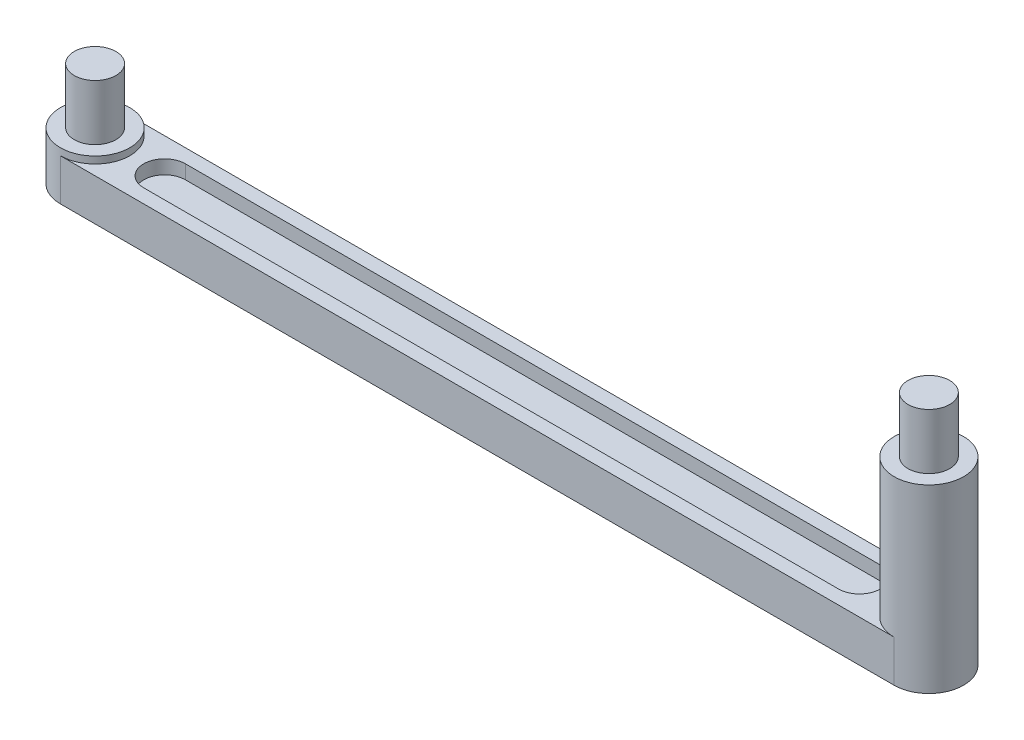
ISO-10303-21;
HEADER;
FILE_DESCRIPTION(('STEP AP214'),'2;1');
FILE_NAME('part.step','',(''),(''),'','','');
FILE_SCHEMA(('AUTOMOTIVE_DESIGN { 1 0 10303 214 1 1 1 1 }'));
ENDSEC;
DATA;
#1=APPLICATION_CONTEXT('core data for automotive mechanical design processes');
#2=APPLICATION_PROTOCOL_DEFINITION('international standard','automotive_design',2000,#1);
#3=PRODUCT_CONTEXT('',#1,'mechanical');
#4=PRODUCT('Part','Part','',(#3));
#5=PRODUCT_RELATED_PRODUCT_CATEGORY('part','',(#4));
#6=PRODUCT_DEFINITION_FORMATION('','',#4);
#7=PRODUCT_DEFINITION_CONTEXT('part definition',#1,'design');
#8=PRODUCT_DEFINITION('design','',#6,#7);
#9=PRODUCT_DEFINITION_SHAPE('','',#8);
#10=(LENGTH_UNIT() NAMED_UNIT(*) SI_UNIT(.MILLI.,.METRE.));
#11=(NAMED_UNIT(*) PLANE_ANGLE_UNIT() SI_UNIT($,.RADIAN.));
#12=(NAMED_UNIT(*) SI_UNIT($,.STERADIAN.) SOLID_ANGLE_UNIT());
#13=UNCERTAINTY_MEASURE_WITH_UNIT(LENGTH_MEASURE(1.E-05),#10,'distance_accuracy_value','');
#14=(GEOMETRIC_REPRESENTATION_CONTEXT(3) GLOBAL_UNCERTAINTY_ASSIGNED_CONTEXT((#13)) GLOBAL_UNIT_ASSIGNED_CONTEXT((#10,
#11,#12)) REPRESENTATION_CONTEXT('',''));
#15=CARTESIAN_POINT('',(0.,0.,0.));
#16=DIRECTION('',(0.,0.,1.));
#17=DIRECTION('',(1.,0.,0.));
#18=AXIS2_PLACEMENT_3D('',#15,#16,#17);
#19=CARTESIAN_POINT('',(30.,3.,0.));
#20=DIRECTION('',(0.,1.,0.));
#21=DIRECTION('',(0.,0.,1.));
#22=AXIS2_PLACEMENT_3D('',#19,#20,#21);
#23=PLANE('',#22);
#24=CARTESIAN_POINT('',(25.,3.,0.));
#25=DIRECTION('',(0.,1.,0.));
#26=DIRECTION('',(0.,0.,1.));
#27=AXIS2_PLACEMENT_3D('',#24,#25,#26);
#28=CIRCLE('',#27,1.50000000000001);
#29=CARTESIAN_POINT('',(25.,3.,1.50000000000001));
#30=VERTEX_POINT('',#29);
#31=CARTESIAN_POINT('',(25.,3.,-1.50000000000001));
#32=VERTEX_POINT('',#31);
#33=EDGE_CURVE('E57',#30,#32,#28,.T.);
#34=ORIENTED_EDGE('',*,*,#33,.F.);
#35=DIRECTION('',(1.,0.,0.));
#36=VECTOR('',#35,1.);
#37=CARTESIAN_POINT('',(25.,3.,1.50000000000001));
#38=LINE('',#37,#36);
#39=CARTESIAN_POINT('',(-25.,3.,1.50000000000001));
#40=VERTEX_POINT('',#39);
#41=EDGE_CURVE('E189',#40,#30,#38,.T.);
#42=ORIENTED_EDGE('',*,*,#41,.F.);
#43=CARTESIAN_POINT('',(-25.,3.,0.));
#44=DIRECTION('',(0.,1.,0.));
#45=DIRECTION('',(0.,0.,1.));
#46=AXIS2_PLACEMENT_3D('',#43,#44,#45);
#47=CIRCLE('',#46,1.50000000000001);
#48=CARTESIAN_POINT('',(-25.,3.,-1.50000000000001));
#49=VERTEX_POINT('',#48);
#50=EDGE_CURVE('E174',#49,#40,#47,.T.);
#51=ORIENTED_EDGE('',*,*,#50,.F.);
#52=DIRECTION('',(-1.,0.,0.));
#53=VECTOR('',#52,1.);
#54=CARTESIAN_POINT('',(25.,3.,-1.50000000000001));
#55=LINE('',#54,#53);
#56=EDGE_CURVE('E184',#32,#49,#55,.T.);
#57=ORIENTED_EDGE('',*,*,#56,.F.);
#58=EDGE_LOOP('',(#34,#42,#51,#57));
#59=FACE_BOUND('',#58,.T.);
#60=DIRECTION('',(1.,0.,0.));
#61=VECTOR('',#60,1.);
#62=CARTESIAN_POINT('',(30.,3.,2.49999999999999));
#63=LINE('',#62,#61);
#64=CARTESIAN_POINT('',(-30.,3.,2.50000000000001));
#65=VERTEX_POINT('',#64);
#66=CARTESIAN_POINT('',(30.,3.,2.49999999999999));
#67=VERTEX_POINT('',#66);
#68=EDGE_CURVE('E65',#65,#67,#63,.T.);
#69=ORIENTED_EDGE('',*,*,#68,.T.);
#70=CARTESIAN_POINT('',(30.,3.,0.));
#71=DIRECTION('',(0.,1.,0.));
#72=DIRECTION('',(0.,0.,1.));
#73=AXIS2_PLACEMENT_3D('',#70,#71,#72);
#74=CIRCLE('',#73,2.5);
#75=CARTESIAN_POINT('',(30.,3.,-2.50000000000001));
#76=VERTEX_POINT('',#75);
#77=EDGE_CURVE('E12',#67,#76,#74,.F.);
#78=ORIENTED_EDGE('',*,*,#77,.T.);
#79=DIRECTION('',(-1.,0.,0.));
#80=VECTOR('',#79,1.);
#81=CARTESIAN_POINT('',(30.,3.,-2.50000000000001));
#82=LINE('',#81,#80);
#83=CARTESIAN_POINT('',(-30.,3.,-2.5));
#84=VERTEX_POINT('',#83);
#85=EDGE_CURVE('E95',#76,#84,#82,.T.);
#86=ORIENTED_EDGE('',*,*,#85,.T.);
#87=CARTESIAN_POINT('',(-30.,3.,0.));
#88=DIRECTION('',(0.,1.,0.));
#89=DIRECTION('',(0.,0.,1.));
#90=AXIS2_PLACEMENT_3D('',#87,#88,#89);
#91=CIRCLE('',#90,2.5);
#92=EDGE_CURVE('E111',#65,#84,#91,.T.);
#93=ORIENTED_EDGE('',*,*,#92,.F.);
#94=EDGE_LOOP('',(#69,#78,#86,#93));
#95=FACE_BOUND('',#94,.T.);
#96=ADVANCED_FACE('F41',(#59,#95),#23,.T.);
#97=CARTESIAN_POINT('',(30.,3.,0.));
#98=DIRECTION('',(0.,-1.,0.));
#99=DIRECTION('',(0.,0.,-1.));
#100=AXIS2_PLACEMENT_3D('',#97,#98,#99);
#101=CYLINDRICAL_SURFACE('',#100,2.5);
#102=CARTESIAN_POINT('',(30.,0.,0.));
#103=DIRECTION('',(0.,1.,0.));
#104=DIRECTION('',(0.,0.,1.));
#105=AXIS2_PLACEMENT_3D('',#102,#103,#104);
#106=CIRCLE('',#105,2.5);
#107=CARTESIAN_POINT('',(30.,0.,2.49999999999999));
#108=VERTEX_POINT('',#107);
#109=CARTESIAN_POINT('',(30.,0.,-2.50000000000001));
#110=VERTEX_POINT('',#109);
#111=EDGE_CURVE('E102',#108,#110,#106,.T.);
#112=ORIENTED_EDGE('',*,*,#111,.T.);
#113=DIRECTION('',(0.,-1.,0.));
#114=VECTOR('',#113,1.);
#115=CARTESIAN_POINT('',(30.,3.,-2.50000000000001));
#116=LINE('',#115,#114);
#117=EDGE_CURVE('E50',#76,#110,#116,.T.);
#118=ORIENTED_EDGE('',*,*,#117,.F.);
#119=ORIENTED_EDGE('',*,*,#77,.F.);
#120=DIRECTION('',(0.,-1.,0.));
#121=VECTOR('',#120,1.);
#122=CARTESIAN_POINT('',(30.,3.,2.49999999999999));
#123=LINE('',#122,#121);
#124=EDGE_CURVE('E88',#67,#108,#123,.T.);
#125=ORIENTED_EDGE('',*,*,#124,.T.);
#126=EDGE_LOOP('',(#112,#118,#119,#125));
#127=FACE_BOUND('',#126,.T.);
#128=CARTESIAN_POINT('',(30.,13.,0.));
#129=DIRECTION('',(0.,1.,0.));
#130=DIRECTION('',(0.,0.,1.));
#131=AXIS2_PLACEMENT_3D('',#128,#129,#130);
#132=CIRCLE('',#131,2.5);
#133=CARTESIAN_POINT('',(30.,13.,2.49999999999999));
#134=VERTEX_POINT('',#133);
#135=EDGE_CURVE('E130',#134,#134,#132,.T.);
#136=ORIENTED_EDGE('',*,*,#135,.F.);
#137=EDGE_LOOP('',(#136));
#138=FACE_BOUND('',#137,.T.);
#139=ADVANCED_FACE('F43',(#127,#138),#101,.T.);
#140=CARTESIAN_POINT('',(30.,3.,-2.50000000000001));
#141=DIRECTION('',(0.,0.,1.));
#142=DIRECTION('',(1.,0.,0.));
#143=AXIS2_PLACEMENT_3D('',#140,#141,#142);
#144=PLANE('',#143);
#145=DIRECTION('',(-1.,0.,0.));
#146=VECTOR('',#145,1.);
#147=CARTESIAN_POINT('',(30.,0.,-2.50000000000001));
#148=LINE('',#147,#146);
#149=CARTESIAN_POINT('',(-30.,0.,-2.5));
#150=VERTEX_POINT('',#149);
#151=EDGE_CURVE('E105',#110,#150,#148,.T.);
#152=ORIENTED_EDGE('',*,*,#151,.T.);
#153=DIRECTION('',(0.,-1.,0.));
#154=VECTOR('',#153,1.);
#155=CARTESIAN_POINT('',(-30.,3.,-2.5));
#156=LINE('',#155,#154);
#157=EDGE_CURVE('E118',#84,#150,#156,.T.);
#158=ORIENTED_EDGE('',*,*,#157,.F.);
#159=ORIENTED_EDGE('',*,*,#85,.F.);
#160=ORIENTED_EDGE('',*,*,#117,.T.);
#161=EDGE_LOOP('',(#152,#158,#159,#160));
#162=FACE_BOUND('',#161,.T.);
#163=ADVANCED_FACE('F141',(#162),#144,.F.);
#164=CARTESIAN_POINT('',(-30.,3.,0.));
#165=DIRECTION('',(0.,-1.,0.));
#166=DIRECTION('',(0.,0.,-1.));
#167=AXIS2_PLACEMENT_3D('',#164,#165,#166);
#168=CYLINDRICAL_SURFACE('',#167,2.5);
#169=CARTESIAN_POINT('',(-30.,0.,0.));
#170=DIRECTION('',(0.,1.,0.));
#171=DIRECTION('',(0.,0.,1.));
#172=AXIS2_PLACEMENT_3D('',#169,#170,#171);
#173=CIRCLE('',#172,2.5);
#174=CARTESIAN_POINT('',(-30.,0.,2.50000000000001));
#175=VERTEX_POINT('',#174);
#176=EDGE_CURVE('E96',#150,#175,#173,.T.);
#177=ORIENTED_EDGE('',*,*,#176,.T.);
#178=DIRECTION('',(0.,-1.,0.));
#179=VECTOR('',#178,1.);
#180=CARTESIAN_POINT('',(-30.,3.,2.50000000000001));
#181=LINE('',#180,#179);
#182=EDGE_CURVE('E91',#65,#175,#181,.T.);
#183=ORIENTED_EDGE('',*,*,#182,.F.);
#184=ORIENTED_EDGE('',*,*,#92,.T.);
#185=ORIENTED_EDGE('',*,*,#157,.T.);
#186=EDGE_LOOP('',(#177,#183,#184,#185));
#187=FACE_BOUND('',#186,.T.);
#188=CARTESIAN_POINT('',(-30.,3.5,0.));
#189=DIRECTION('',(0.,1.,0.));
#190=DIRECTION('',(0.,0.,1.));
#191=AXIS2_PLACEMENT_3D('',#188,#189,#190);
#192=CIRCLE('',#191,2.5);
#193=CARTESIAN_POINT('',(-30.,3.5,2.50000000000001));
#194=VERTEX_POINT('',#193);
#195=EDGE_CURVE('E107',#194,#194,#192,.T.);
#196=ORIENTED_EDGE('',*,*,#195,.F.);
#197=EDGE_LOOP('',(#196));
#198=FACE_BOUND('',#197,.T.);
#199=ADVANCED_FACE('F143',(#187,#198),#168,.T.);
#200=CARTESIAN_POINT('',(30.,3.,2.49999999999999));
#201=DIRECTION('',(0.,0.,-1.));
#202=DIRECTION('',(-1.,0.,0.));
#203=AXIS2_PLACEMENT_3D('',#200,#201,#202);
#204=PLANE('',#203);
#205=DIRECTION('',(1.,0.,0.));
#206=VECTOR('',#205,1.);
#207=CARTESIAN_POINT('',(30.,0.,2.49999999999999));
#208=LINE('',#207,#206);
#209=EDGE_CURVE('E85',#175,#108,#208,.T.);
#210=ORIENTED_EDGE('',*,*,#209,.T.);
#211=ORIENTED_EDGE('',*,*,#124,.F.);
#212=ORIENTED_EDGE('',*,*,#68,.F.);
#213=ORIENTED_EDGE('',*,*,#182,.T.);
#214=EDGE_LOOP('',(#210,#211,#212,#213));
#215=FACE_BOUND('',#214,.T.);
#216=ADVANCED_FACE('F87',(#215),#204,.F.);
#217=CARTESIAN_POINT('',(30.,0.,0.));
#218=DIRECTION('',(0.,1.,0.));
#219=DIRECTION('',(0.,0.,1.));
#220=AXIS2_PLACEMENT_3D('',#217,#218,#219);
#221=PLANE('',#220);
#222=ORIENTED_EDGE('',*,*,#111,.F.);
#223=ORIENTED_EDGE('',*,*,#209,.F.);
#224=ORIENTED_EDGE('',*,*,#176,.F.);
#225=ORIENTED_EDGE('',*,*,#151,.F.);
#226=EDGE_LOOP('',(#222,#223,#224,#225));
#227=FACE_BOUND('',#226,.T.);
#228=ADVANCED_FACE('F104',(#227),#221,.F.);
#229=CARTESIAN_POINT('',(0.,3.5,0.));
#230=DIRECTION('',(0.,1.,0.));
#231=DIRECTION('',(0.,0.,1.));
#232=AXIS2_PLACEMENT_3D('',#229,#230,#231);
#233=PLANE('',#232);
#234=CARTESIAN_POINT('',(-30.,3.5,0.));
#235=DIRECTION('',(0.,1.,0.));
#236=DIRECTION('',(0.,0.,1.));
#237=AXIS2_PLACEMENT_3D('',#234,#235,#236);
#238=CIRCLE('',#237,1.5);
#239=CARTESIAN_POINT('',(-30.,3.5,1.50000000000001));
#240=VERTEX_POINT('',#239);
#241=EDGE_CURVE('E122',#240,#240,#238,.F.);
#242=ORIENTED_EDGE('',*,*,#241,.T.);
#243=EDGE_LOOP('',(#242));
#244=FACE_BOUND('',#243,.T.);
#245=ORIENTED_EDGE('',*,*,#195,.T.);
#246=EDGE_LOOP('',(#245));
#247=FACE_BOUND('',#246,.T.);
#248=ADVANCED_FACE('F231',(#244,#247),#233,.T.);
#249=CARTESIAN_POINT('',(-30.,15.7426406871193,0.));
#250=DIRECTION('',(0.,-1.,0.));
#251=DIRECTION('',(0.,0.,-1.));
#252=AXIS2_PLACEMENT_3D('',#249,#250,#251);
#253=CYLINDRICAL_SURFACE('',#252,1.5);
#254=ORIENTED_EDGE('',*,*,#241,.F.);
#255=EDGE_LOOP('',(#254));
#256=FACE_BOUND('',#255,.T.);
#257=CARTESIAN_POINT('',(-30.,7.5,0.));
#258=DIRECTION('',(0.,1.,0.));
#259=DIRECTION('',(0.,0.,1.));
#260=AXIS2_PLACEMENT_3D('',#257,#258,#259);
#261=CIRCLE('',#260,1.5);
#262=CARTESIAN_POINT('',(-30.,7.5,1.50000000000001));
#263=VERTEX_POINT('',#262);
#264=EDGE_CURVE('E124',#263,#263,#261,.T.);
#265=ORIENTED_EDGE('',*,*,#264,.F.);
#266=EDGE_LOOP('',(#265));
#267=FACE_BOUND('',#266,.T.);
#268=ADVANCED_FACE('F263',(#256,#267),#253,.T.);
#269=CARTESIAN_POINT('',(0.,7.5,0.));
#270=DIRECTION('',(0.,1.,0.));
#271=DIRECTION('',(0.,0.,1.));
#272=AXIS2_PLACEMENT_3D('',#269,#270,#271);
#273=PLANE('',#272);
#274=ORIENTED_EDGE('',*,*,#264,.T.);
#275=EDGE_LOOP('',(#274));
#276=FACE_BOUND('',#275,.T.);
#277=ADVANCED_FACE('F221',(#276),#273,.T.);
#278=CARTESIAN_POINT('',(0.,13.,0.));
#279=DIRECTION('',(0.,1.,0.));
#280=DIRECTION('',(0.,0.,1.));
#281=AXIS2_PLACEMENT_3D('',#278,#279,#280);
#282=PLANE('',#281);
#283=CARTESIAN_POINT('',(30.,13.,0.));
#284=DIRECTION('',(0.,1.,0.));
#285=DIRECTION('',(0.,0.,1.));
#286=AXIS2_PLACEMENT_3D('',#283,#284,#285);
#287=CIRCLE('',#286,1.5);
#288=CARTESIAN_POINT('',(30.,13.,1.49999999999999));
#289=VERTEX_POINT('',#288);
#290=EDGE_CURVE('E45',#289,#289,#287,.F.);
#291=ORIENTED_EDGE('',*,*,#290,.T.);
#292=EDGE_LOOP('',(#291));
#293=FACE_BOUND('',#292,.T.);
#294=ORIENTED_EDGE('',*,*,#135,.T.);
#295=EDGE_LOOP('',(#294));
#296=FACE_BOUND('',#295,.T.);
#297=ADVANCED_FACE('F207',(#293,#296),#282,.T.);
#298=CARTESIAN_POINT('',(30.,25.2426406871193,0.));
#299=DIRECTION('',(0.,-1.,0.));
#300=DIRECTION('',(0.,0.,-1.));
#301=AXIS2_PLACEMENT_3D('',#298,#299,#300);
#302=CYLINDRICAL_SURFACE('',#301,1.5);
#303=ORIENTED_EDGE('',*,*,#290,.F.);
#304=EDGE_LOOP('',(#303));
#305=FACE_BOUND('',#304,.T.);
#306=CARTESIAN_POINT('',(30.,17.,0.));
#307=DIRECTION('',(0.,1.,0.));
#308=DIRECTION('',(0.,0.,1.));
#309=AXIS2_PLACEMENT_3D('',#306,#307,#308);
#310=CIRCLE('',#309,1.5);
#311=CARTESIAN_POINT('',(30.,17.,1.49999999999999));
#312=VERTEX_POINT('',#311);
#313=EDGE_CURVE('E199',#312,#312,#310,.T.);
#314=ORIENTED_EDGE('',*,*,#313,.F.);
#315=EDGE_LOOP('',(#314));
#316=FACE_BOUND('',#315,.T.);
#317=ADVANCED_FACE('F210',(#305,#316),#302,.T.);
#318=CARTESIAN_POINT('',(0.,17.,0.));
#319=DIRECTION('',(0.,1.,0.));
#320=DIRECTION('',(0.,0.,1.));
#321=AXIS2_PLACEMENT_3D('',#318,#319,#320);
#322=PLANE('',#321);
#323=ORIENTED_EDGE('',*,*,#313,.T.);
#324=EDGE_LOOP('',(#323));
#325=FACE_BOUND('',#324,.T.);
#326=ADVANCED_FACE('F213',(#325),#322,.T.);
#327=CARTESIAN_POINT('',(25.,-53.084837759948,0.));
#328=DIRECTION('',(0.,1.,0.));
#329=DIRECTION('',(0.,0.,1.));
#330=AXIS2_PLACEMENT_3D('',#327,#328,#329);
#331=CYLINDRICAL_SURFACE('',#330,1.50000000000001);
#332=CARTESIAN_POINT('',(25.,2.,0.));
#333=DIRECTION('',(0.,1.,0.));
#334=DIRECTION('',(0.,0.,1.));
#335=AXIS2_PLACEMENT_3D('',#332,#333,#334);
#336=CIRCLE('',#335,1.50000000000001);
#337=CARTESIAN_POINT('',(25.,2.,-1.50000000000001));
#338=VERTEX_POINT('',#337);
#339=CARTESIAN_POINT('',(25.,2.,1.50000000000001));
#340=VERTEX_POINT('',#339);
#341=EDGE_CURVE('E200',#338,#340,#336,.F.);
#342=ORIENTED_EDGE('',*,*,#341,.T.);
#343=DIRECTION('',(0.,1.,0.));
#344=VECTOR('',#343,1.);
#345=CARTESIAN_POINT('',(25.,-53.084837759948,1.50000000000001));
#346=LINE('',#345,#344);
#347=EDGE_CURVE('E194',#340,#30,#346,.T.);
#348=ORIENTED_EDGE('',*,*,#347,.T.);
#349=ORIENTED_EDGE('',*,*,#33,.T.);
#350=DIRECTION('',(0.,1.,0.));
#351=VECTOR('',#350,1.);
#352=CARTESIAN_POINT('',(25.,-53.084837759948,-1.50000000000001));
#353=LINE('',#352,#351);
#354=EDGE_CURVE('E181',#338,#32,#353,.T.);
#355=ORIENTED_EDGE('',*,*,#354,.F.);
#356=EDGE_LOOP('',(#342,#348,#349,#355));
#357=FACE_BOUND('',#356,.T.);
#358=ADVANCED_FACE('F219',(#357),#331,.F.);
#359=CARTESIAN_POINT('',(25.,-53.084837759948,1.50000000000001));
#360=DIRECTION('',(0.,0.,1.));
#361=DIRECTION('',(1.,0.,0.));
#362=AXIS2_PLACEMENT_3D('',#359,#360,#361);
#363=PLANE('',#362);
#364=DIRECTION('',(-1.,0.,0.));
#365=VECTOR('',#364,1.);
#366=CARTESIAN_POINT('',(25.,2.,1.50000000000001));
#367=LINE('',#366,#365);
#368=CARTESIAN_POINT('',(-25.,2.,1.50000000000002));
#369=VERTEX_POINT('',#368);
#370=EDGE_CURVE('E343',#340,#369,#367,.T.);
#371=ORIENTED_EDGE('',*,*,#370,.T.);
#372=DIRECTION('',(0.,1.,0.));
#373=VECTOR('',#372,1.);
#374=CARTESIAN_POINT('',(-25.,-53.084837759948,1.50000000000001));
#375=LINE('',#374,#373);
#376=EDGE_CURVE('E180',#369,#40,#375,.T.);
#377=ORIENTED_EDGE('',*,*,#376,.T.);
#378=ORIENTED_EDGE('',*,*,#41,.T.);
#379=ORIENTED_EDGE('',*,*,#347,.F.);
#380=EDGE_LOOP('',(#371,#377,#378,#379));
#381=FACE_BOUND('',#380,.T.);
#382=ADVANCED_FACE('F303',(#381),#363,.F.);
#383=CARTESIAN_POINT('',(-25.,-53.084837759948,0.));
#384=DIRECTION('',(0.,1.,0.));
#385=DIRECTION('',(0.,0.,1.));
#386=AXIS2_PLACEMENT_3D('',#383,#384,#385);
#387=CYLINDRICAL_SURFACE('',#386,1.50000000000001);
#388=CARTESIAN_POINT('',(-25.,2.,0.));
#389=DIRECTION('',(0.,1.,0.));
#390=DIRECTION('',(0.,0.,1.));
#391=AXIS2_PLACEMENT_3D('',#388,#389,#390);
#392=CIRCLE('',#391,1.50000000000001);
#393=CARTESIAN_POINT('',(-25.,2.,-1.50000000000001));
#394=VERTEX_POINT('',#393);
#395=EDGE_CURVE('E177',#369,#394,#392,.F.);
#396=ORIENTED_EDGE('',*,*,#395,.T.);
#397=DIRECTION('',(0.,1.,0.));
#398=VECTOR('',#397,1.);
#399=CARTESIAN_POINT('',(-25.,-53.084837759948,-1.50000000000001));
#400=LINE('',#399,#398);
#401=EDGE_CURVE('E169',#394,#49,#400,.T.);
#402=ORIENTED_EDGE('',*,*,#401,.T.);
#403=ORIENTED_EDGE('',*,*,#50,.T.);
#404=ORIENTED_EDGE('',*,*,#376,.F.);
#405=EDGE_LOOP('',(#396,#402,#403,#404));
#406=FACE_BOUND('',#405,.T.);
#407=ADVANCED_FACE('F171',(#406),#387,.F.);
#408=CARTESIAN_POINT('',(25.,-53.084837759948,-1.50000000000001));
#409=DIRECTION('',(0.,0.,-1.));
#410=DIRECTION('',(-1.,0.,0.));
#411=AXIS2_PLACEMENT_3D('',#408,#409,#410);
#412=PLANE('',#411);
#413=DIRECTION('',(1.,0.,0.));
#414=VECTOR('',#413,1.);
#415=CARTESIAN_POINT('',(25.,2.,-1.50000000000001));
#416=LINE('',#415,#414);
#417=EDGE_CURVE('E198',#394,#338,#416,.T.);
#418=ORIENTED_EDGE('',*,*,#417,.T.);
#419=ORIENTED_EDGE('',*,*,#354,.T.);
#420=ORIENTED_EDGE('',*,*,#56,.T.);
#421=ORIENTED_EDGE('',*,*,#401,.F.);
#422=EDGE_LOOP('',(#418,#419,#420,#421));
#423=FACE_BOUND('',#422,.T.);
#424=ADVANCED_FACE('F185',(#423),#412,.F.);
#425=CARTESIAN_POINT('',(30.,2.,0.));
#426=DIRECTION('',(0.,1.,0.));
#427=DIRECTION('',(0.,0.,1.));
#428=AXIS2_PLACEMENT_3D('',#425,#426,#427);
#429=PLANE('',#428);
#430=ORIENTED_EDGE('',*,*,#341,.F.);
#431=ORIENTED_EDGE('',*,*,#417,.F.);
#432=ORIENTED_EDGE('',*,*,#395,.F.);
#433=ORIENTED_EDGE('',*,*,#370,.F.);
#434=EDGE_LOOP('',(#430,#431,#432,#433));
#435=FACE_BOUND('',#434,.T.);
#436=ADVANCED_FACE('F328',(#435),#429,.T.);
#437=CLOSED_SHELL('',(#96,#139,#163,#199,#216,#228,#248,#268,#277,#297,#317,#326,#358,#382,#407,
#424,#436));
#438=MANIFOLD_SOLID_BREP('B2',#437);
#439=ADVANCED_BREP_SHAPE_REPRESENTATION('',(#18,#438),#14);
#440=SHAPE_DEFINITION_REPRESENTATION(#9,#439);
ENDSEC;
END-ISO-10303-21;
